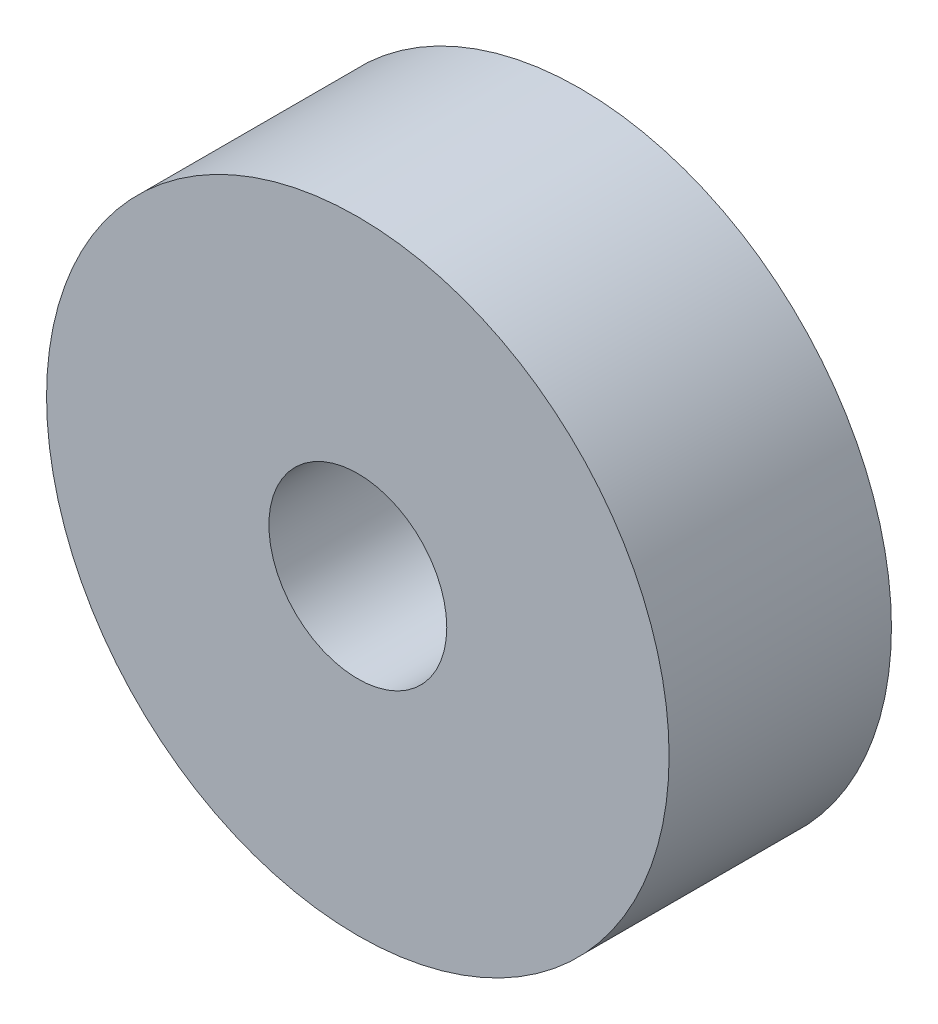
ISO-10303-21;
HEADER;
FILE_DESCRIPTION(('STEP AP214'),'2;1');
FILE_NAME('part.step','',(''),(''),'','','');
FILE_SCHEMA(('AUTOMOTIVE_DESIGN { 1 0 10303 214 1 1 1 1 }'));
ENDSEC;
DATA;
#1=APPLICATION_CONTEXT('core data for automotive mechanical design processes');
#2=APPLICATION_PROTOCOL_DEFINITION('international standard','automotive_design',2000,#1);
#3=PRODUCT_CONTEXT('',#1,'mechanical');
#4=PRODUCT('Part','Part','',(#3));
#5=PRODUCT_RELATED_PRODUCT_CATEGORY('part','',(#4));
#6=PRODUCT_DEFINITION_FORMATION('','',#4);
#7=PRODUCT_DEFINITION_CONTEXT('part definition',#1,'design');
#8=PRODUCT_DEFINITION('design','',#6,#7);
#9=PRODUCT_DEFINITION_SHAPE('','',#8);
#10=(LENGTH_UNIT() NAMED_UNIT(*) SI_UNIT(.MILLI.,.METRE.));
#11=(NAMED_UNIT(*) PLANE_ANGLE_UNIT() SI_UNIT($,.RADIAN.));
#12=(NAMED_UNIT(*) SI_UNIT($,.STERADIAN.) SOLID_ANGLE_UNIT());
#13=UNCERTAINTY_MEASURE_WITH_UNIT(LENGTH_MEASURE(1.E-05),#10,'distance_accuracy_value','');
#14=(GEOMETRIC_REPRESENTATION_CONTEXT(3) GLOBAL_UNCERTAINTY_ASSIGNED_CONTEXT((#13)) GLOBAL_UNIT_ASSIGNED_CONTEXT((#10,
#11,#12)) REPRESENTATION_CONTEXT('',''));
#15=CARTESIAN_POINT('',(0.,0.,0.));
#16=DIRECTION('',(0.,0.,1.));
#17=DIRECTION('',(1.,0.,0.));
#18=AXIS2_PLACEMENT_3D('',#15,#16,#17);
#19=CARTESIAN_POINT('',(0.,0.,5.));
#20=DIRECTION('',(0.,0.,1.));
#21=DIRECTION('',(1.,0.,0.));
#22=AXIS2_PLACEMENT_3D('',#19,#20,#21);
#23=PLANE('',#22);
#24=CARTESIAN_POINT('',(0.,0.,5.));
#25=DIRECTION('',(0.,0.,1.));
#26=DIRECTION('',(1.,0.,0.));
#27=AXIS2_PLACEMENT_3D('',#24,#25,#26);
#28=CIRCLE('',#27,7.);
#29=CARTESIAN_POINT('',(7.,0.,5.));
#30=VERTEX_POINT('',#29);
#31=EDGE_CURVE('E10',#30,#30,#28,.T.);
#32=ORIENTED_EDGE('',*,*,#31,.T.);
#33=EDGE_LOOP('',(#32));
#34=FACE_BOUND('',#33,.T.);
#35=CARTESIAN_POINT('',(0.,0.,5.));
#36=DIRECTION('',(0.,0.,1.));
#37=DIRECTION('',(1.,0.,0.));
#38=AXIS2_PLACEMENT_3D('',#35,#36,#37);
#39=CIRCLE('',#38,2.);
#40=CARTESIAN_POINT('',(2.,0.,5.));
#41=VERTEX_POINT('',#40);
#42=EDGE_CURVE('E41',#41,#41,#39,.T.);
#43=ORIENTED_EDGE('',*,*,#42,.F.);
#44=EDGE_LOOP('',(#43));
#45=FACE_BOUND('',#44,.T.);
#46=ADVANCED_FACE('F30',(#34,#45),#23,.T.);
#47=CARTESIAN_POINT('',(0.,0.,0.));
#48=DIRECTION('',(0.,0.,1.));
#49=DIRECTION('',(1.,0.,0.));
#50=AXIS2_PLACEMENT_3D('',#47,#48,#49);
#51=PLANE('',#50);
#52=CARTESIAN_POINT('',(0.,0.,0.));
#53=DIRECTION('',(0.,0.,1.));
#54=DIRECTION('',(1.,0.,0.));
#55=AXIS2_PLACEMENT_3D('',#52,#53,#54);
#56=CIRCLE('',#55,7.);
#57=CARTESIAN_POINT('',(7.,0.,0.));
#58=VERTEX_POINT('',#57);
#59=EDGE_CURVE('E34',#58,#58,#56,.T.);
#60=ORIENTED_EDGE('',*,*,#59,.F.);
#61=EDGE_LOOP('',(#60));
#62=FACE_BOUND('',#61,.T.);
#63=CARTESIAN_POINT('',(0.,0.,0.));
#64=DIRECTION('',(0.,0.,1.));
#65=DIRECTION('',(1.,0.,0.));
#66=AXIS2_PLACEMENT_3D('',#63,#64,#65);
#67=CIRCLE('',#66,2.);
#68=CARTESIAN_POINT('',(2.,0.,0.));
#69=VERTEX_POINT('',#68);
#70=EDGE_CURVE('E43',#69,#69,#67,.T.);
#71=ORIENTED_EDGE('',*,*,#70,.T.);
#72=EDGE_LOOP('',(#71));
#73=FACE_BOUND('',#72,.T.);
#74=ADVANCED_FACE('F53',(#62,#73),#51,.F.);
#75=CARTESIAN_POINT('',(0.,0.,5.));
#76=DIRECTION('',(0.,0.,-1.));
#77=DIRECTION('',(-1.,0.,0.));
#78=AXIS2_PLACEMENT_3D('',#75,#76,#77);
#79=CYLINDRICAL_SURFACE('',#78,7.);
#80=ORIENTED_EDGE('',*,*,#31,.F.);
#81=EDGE_LOOP('',(#80));
#82=FACE_BOUND('',#81,.T.);
#83=ORIENTED_EDGE('',*,*,#59,.T.);
#84=EDGE_LOOP('',(#83));
#85=FACE_BOUND('',#84,.T.);
#86=ADVANCED_FACE('F32',(#82,#85),#79,.T.);
#87=CARTESIAN_POINT('',(0.,0.,5.));
#88=DIRECTION('',(0.,0.,-1.));
#89=DIRECTION('',(-1.,0.,0.));
#90=AXIS2_PLACEMENT_3D('',#87,#88,#89);
#91=CYLINDRICAL_SURFACE('',#90,2.);
#92=ORIENTED_EDGE('',*,*,#42,.T.);
#93=EDGE_LOOP('',(#92));
#94=FACE_BOUND('',#93,.T.);
#95=ORIENTED_EDGE('',*,*,#70,.F.);
#96=EDGE_LOOP('',(#95));
#97=FACE_BOUND('',#96,.T.);
#98=ADVANCED_FACE('F49',(#94,#97),#91,.F.);
#99=CLOSED_SHELL('',(#46,#74,#86,#98));
#100=MANIFOLD_SOLID_BREP('B2',#99);
#101=ADVANCED_BREP_SHAPE_REPRESENTATION('',(#18,#100),#14);
#102=SHAPE_DEFINITION_REPRESENTATION(#9,#101);
ENDSEC;
END-ISO-10303-21;
